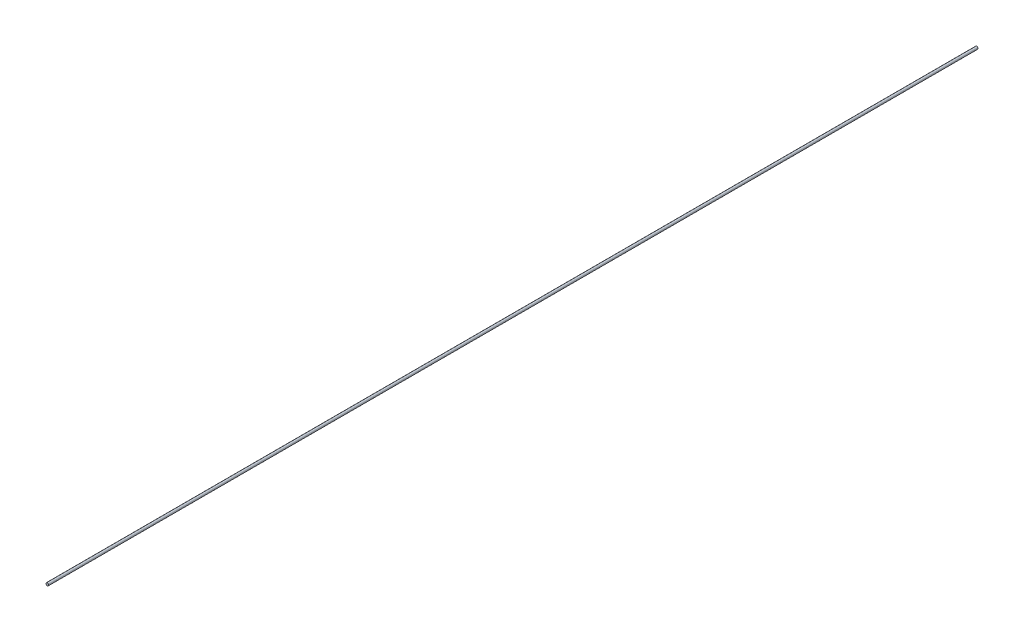
ISO-10303-21;
HEADER;
FILE_DESCRIPTION(('STEP AP214'),'2;1');
FILE_NAME('part.step','',(''),(''),'','','');
FILE_SCHEMA(('AUTOMOTIVE_DESIGN { 1 0 10303 214 1 1 1 1 }'));
ENDSEC;
DATA;
#1=APPLICATION_CONTEXT('core data for automotive mechanical design processes');
#2=APPLICATION_PROTOCOL_DEFINITION('international standard','automotive_design',2000,#1);
#3=PRODUCT_CONTEXT('',#1,'mechanical');
#4=PRODUCT('Part','Part','',(#3));
#5=PRODUCT_RELATED_PRODUCT_CATEGORY('part','',(#4));
#6=PRODUCT_DEFINITION_FORMATION('','',#4);
#7=PRODUCT_DEFINITION_CONTEXT('part definition',#1,'design');
#8=PRODUCT_DEFINITION('design','',#6,#7);
#9=PRODUCT_DEFINITION_SHAPE('','',#8);
#10=(LENGTH_UNIT() NAMED_UNIT(*) SI_UNIT(.MILLI.,.METRE.));
#11=(NAMED_UNIT(*) PLANE_ANGLE_UNIT() SI_UNIT($,.RADIAN.));
#12=(NAMED_UNIT(*) SI_UNIT($,.STERADIAN.) SOLID_ANGLE_UNIT());
#13=UNCERTAINTY_MEASURE_WITH_UNIT(LENGTH_MEASURE(1.E-05),#10,'distance_accuracy_value','');
#14=(GEOMETRIC_REPRESENTATION_CONTEXT(3) GLOBAL_UNCERTAINTY_ASSIGNED_CONTEXT((#13)) GLOBAL_UNIT_ASSIGNED_CONTEXT((#10,
#11,#12)) REPRESENTATION_CONTEXT('',''));
#15=CARTESIAN_POINT('',(0.,0.,0.));
#16=DIRECTION('',(0.,0.,1.));
#17=DIRECTION('',(1.,0.,0.));
#18=AXIS2_PLACEMENT_3D('',#15,#16,#17);
#19=CARTESIAN_POINT('',(0.,0.,1060.));
#20=DIRECTION('',(0.,0.,-1.));
#21=DIRECTION('',(-1.,0.,0.));
#22=AXIS2_PLACEMENT_3D('',#19,#20,#21);
#23=CYLINDRICAL_SURFACE('',#22,1.5);
#24=CARTESIAN_POINT('',(0.,0.,1060.));
#25=DIRECTION('',(0.,0.,1.));
#26=DIRECTION('',(1.,0.,0.));
#27=AXIS2_PLACEMENT_3D('',#24,#25,#26);
#28=CIRCLE('',#27,1.5);
#29=CARTESIAN_POINT('',(1.5,0.,1060.));
#30=VERTEX_POINT('',#29);
#31=EDGE_CURVE('E10',#30,#30,#28,.T.);
#32=ORIENTED_EDGE('',*,*,#31,.F.);
#33=EDGE_LOOP('',(#32));
#34=FACE_BOUND('',#33,.T.);
#35=CARTESIAN_POINT('',(0.,0.,0.));
#36=DIRECTION('',(0.,0.,1.));
#37=DIRECTION('',(1.,0.,0.));
#38=AXIS2_PLACEMENT_3D('',#35,#36,#37);
#39=CIRCLE('',#38,1.5);
#40=CARTESIAN_POINT('',(1.5,0.,0.));
#41=VERTEX_POINT('',#40);
#42=EDGE_CURVE('E40',#41,#41,#39,.T.);
#43=ORIENTED_EDGE('',*,*,#42,.T.);
#44=EDGE_LOOP('',(#43));
#45=FACE_BOUND('',#44,.T.);
#46=ADVANCED_FACE('F37',(#34,#45),#23,.T.);
#47=CARTESIAN_POINT('',(0.,0.,1060.));
#48=DIRECTION('',(0.,0.,1.));
#49=DIRECTION('',(1.,0.,0.));
#50=AXIS2_PLACEMENT_3D('',#47,#48,#49);
#51=PLANE('',#50);
#52=ORIENTED_EDGE('',*,*,#31,.T.);
#53=EDGE_LOOP('',(#52));
#54=FACE_BOUND('',#53,.T.);
#55=ADVANCED_FACE('F54',(#54),#51,.T.);
#56=CARTESIAN_POINT('',(0.,0.,0.));
#57=DIRECTION('',(0.,0.,1.));
#58=DIRECTION('',(1.,0.,0.));
#59=AXIS2_PLACEMENT_3D('',#56,#57,#58);
#60=PLANE('',#59);
#61=ORIENTED_EDGE('',*,*,#42,.F.);
#62=EDGE_LOOP('',(#61));
#63=FACE_BOUND('',#62,.T.);
#64=ADVANCED_FACE('F52',(#63),#60,.F.);
#65=CLOSED_SHELL('',(#46,#55,#64));
#66=MANIFOLD_SOLID_BREP('B2',#65);
#67=ADVANCED_BREP_SHAPE_REPRESENTATION('',(#18,#66),#14);
#68=SHAPE_DEFINITION_REPRESENTATION(#9,#67);
ENDSEC;
END-ISO-10303-21;
